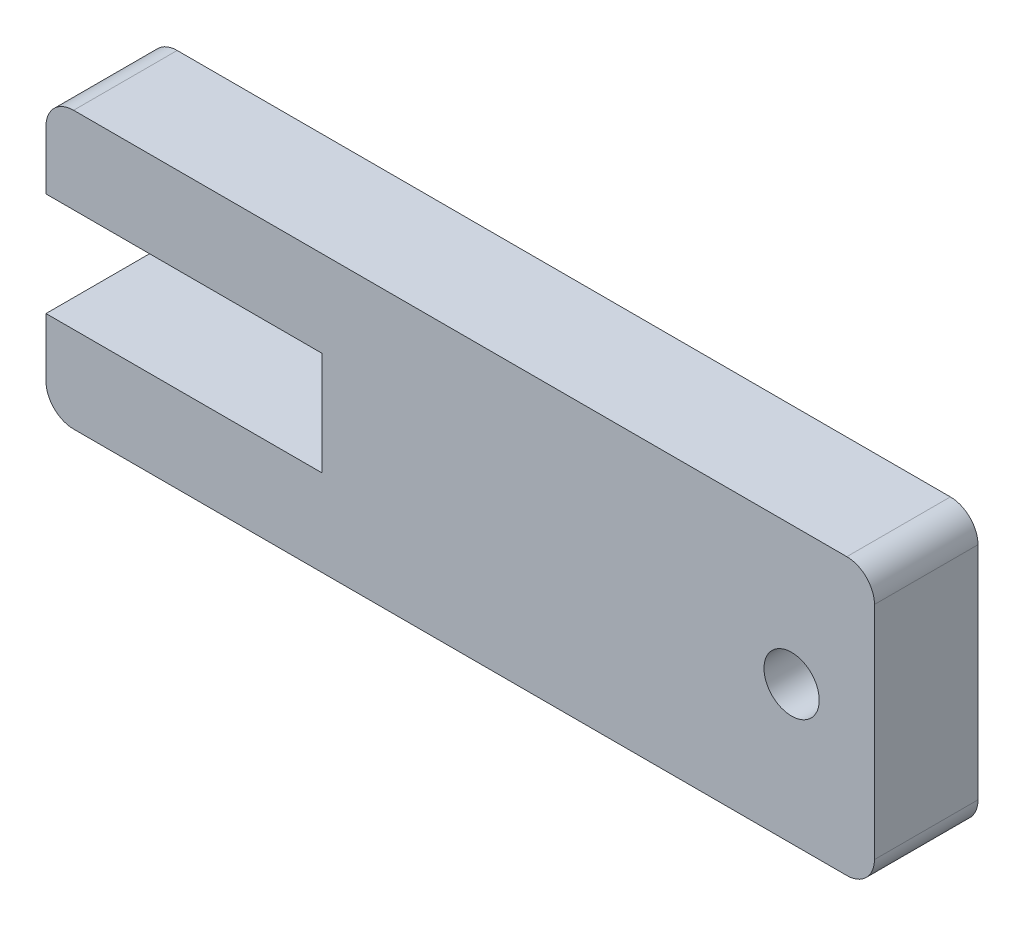
ISO-10303-21;
HEADER;
FILE_DESCRIPTION(('STEP AP214'),'2;1');
FILE_NAME('part.step','',(''),(''),'','','');
FILE_SCHEMA(('AUTOMOTIVE_DESIGN { 1 0 10303 214 1 1 1 1 }'));
ENDSEC;
DATA;
#1=APPLICATION_CONTEXT('core data for automotive mechanical design processes');
#2=APPLICATION_PROTOCOL_DEFINITION('international standard','automotive_design',2000,#1);
#3=PRODUCT_CONTEXT('',#1,'mechanical');
#4=PRODUCT('Part','Part','',(#3));
#5=PRODUCT_RELATED_PRODUCT_CATEGORY('part','',(#4));
#6=PRODUCT_DEFINITION_FORMATION('','',#4);
#7=PRODUCT_DEFINITION_CONTEXT('part definition',#1,'design');
#8=PRODUCT_DEFINITION('design','',#6,#7);
#9=PRODUCT_DEFINITION_SHAPE('','',#8);
#10=(LENGTH_UNIT() NAMED_UNIT(*) SI_UNIT(.MILLI.,.METRE.));
#11=(NAMED_UNIT(*) PLANE_ANGLE_UNIT() SI_UNIT($,.RADIAN.));
#12=(NAMED_UNIT(*) SI_UNIT($,.STERADIAN.) SOLID_ANGLE_UNIT());
#13=UNCERTAINTY_MEASURE_WITH_UNIT(LENGTH_MEASURE(1.E-05),#10,'distance_accuracy_value','');
#14=(GEOMETRIC_REPRESENTATION_CONTEXT(3) GLOBAL_UNCERTAINTY_ASSIGNED_CONTEXT((#13)) GLOBAL_UNIT_ASSIGNED_CONTEXT((#10,
#11,#12)) REPRESENTATION_CONTEXT('',''));
#15=CARTESIAN_POINT('',(0.,0.,0.));
#16=DIRECTION('',(0.,0.,1.));
#17=DIRECTION('',(1.,0.,0.));
#18=AXIS2_PLACEMENT_3D('',#15,#16,#17);
#19=CARTESIAN_POINT('',(0.,-2.38125,2.38125));
#20=DIRECTION('',(1.,0.,0.));
#21=DIRECTION('',(0.,0.,-1.));
#22=AXIS2_PLACEMENT_3D('',#19,#20,#21);
#23=PLANE('',#22);
#24=DIRECTION('',(0.,-1.,0.));
#25=VECTOR('',#24,1.);
#26=CARTESIAN_POINT('',(0.,-2.38125,-2.38125));
#27=LINE('',#26,#25);
#28=CARTESIAN_POINT('',(0.,2.38125,-2.38125));
#29=VERTEX_POINT('',#28);
#30=CARTESIAN_POINT('',(0.,-2.38125,-2.38125));
#31=VERTEX_POINT('',#30);
#32=EDGE_CURVE('E148',#29,#31,#27,.T.);
#33=ORIENTED_EDGE('',*,*,#32,.T.);
#34=DIRECTION('',(0.,0.,-1.));
#35=VECTOR('',#34,1.);
#36=CARTESIAN_POINT('',(0.,-2.38125,2.38125));
#37=LINE('',#36,#35);
#38=CARTESIAN_POINT('',(0.,-2.38125,2.38125));
#39=VERTEX_POINT('',#38);
#40=EDGE_CURVE('E129',#39,#31,#37,.T.);
#41=ORIENTED_EDGE('',*,*,#40,.F.);
#42=DIRECTION('',(0.,-1.,0.));
#43=VECTOR('',#42,1.);
#44=CARTESIAN_POINT('',(0.,-2.38125,2.38125));
#45=LINE('',#44,#43);
#46=CARTESIAN_POINT('',(0.,2.38125,2.38125));
#47=VERTEX_POINT('',#46);
#48=EDGE_CURVE('E136',#47,#39,#45,.T.);
#49=ORIENTED_EDGE('',*,*,#48,.F.);
#50=DIRECTION('',(0.,0.,-1.));
#51=VECTOR('',#50,1.);
#52=CARTESIAN_POINT('',(0.,2.38125,2.38125));
#53=LINE('',#52,#51);
#54=EDGE_CURVE('E204',#47,#29,#53,.T.);
#55=ORIENTED_EDGE('',*,*,#54,.T.);
#56=EDGE_LOOP('',(#33,#41,#49,#55));
#57=FACE_BOUND('',#56,.T.);
#58=ADVANCED_FACE('F34',(#57),#23,.F.);
#59=CARTESIAN_POINT('',(-12.7,-2.38125,2.38125));
#60=DIRECTION('',(0.,-1.,0.));
#61=DIRECTION('',(0.,0.,-1.));
#62=AXIS2_PLACEMENT_3D('',#59,#60,#61);
#63=PLANE('',#62);
#64=DIRECTION('',(-1.,0.,0.));
#65=VECTOR('',#64,1.);
#66=CARTESIAN_POINT('',(-12.7,-2.38125,-2.38125));
#67=LINE('',#66,#65);
#68=CARTESIAN_POINT('',(-12.7,-2.38125,-2.38125));
#69=VERTEX_POINT('',#68);
#70=EDGE_CURVE('E212',#31,#69,#67,.T.);
#71=ORIENTED_EDGE('',*,*,#70,.T.);
#72=DIRECTION('',(0.,0.,-1.));
#73=VECTOR('',#72,1.);
#74=CARTESIAN_POINT('',(-12.7,-2.38125,2.38125));
#75=LINE('',#74,#73);
#76=CARTESIAN_POINT('',(-12.7,-2.38125,2.38125));
#77=VERTEX_POINT('',#76);
#78=EDGE_CURVE('E132',#77,#69,#75,.T.);
#79=ORIENTED_EDGE('',*,*,#78,.F.);
#80=DIRECTION('',(-1.,0.,0.));
#81=VECTOR('',#80,1.);
#82=CARTESIAN_POINT('',(-12.7,-2.38125,2.38125));
#83=LINE('',#82,#81);
#84=EDGE_CURVE('E125',#39,#77,#83,.T.);
#85=ORIENTED_EDGE('',*,*,#84,.F.);
#86=ORIENTED_EDGE('',*,*,#40,.T.);
#87=EDGE_LOOP('',(#71,#79,#85,#86));
#88=FACE_BOUND('',#87,.T.);
#89=ADVANCED_FACE('F127',(#88),#63,.F.);
#90=CARTESIAN_POINT('',(-12.7,-2.38125,2.38125));
#91=DIRECTION('',(1.,0.,0.));
#92=DIRECTION('',(0.,0.,-1.));
#93=AXIS2_PLACEMENT_3D('',#90,#91,#92);
#94=PLANE('',#93);
#95=DIRECTION('',(0.,-1.,0.));
#96=VECTOR('',#95,1.);
#97=CARTESIAN_POINT('',(-12.7,-2.38125,-2.38125));
#98=LINE('',#97,#96);
#99=CARTESIAN_POINT('',(-12.7,-5.08,-2.38125));
#100=VERTEX_POINT('',#99);
#101=EDGE_CURVE('E215',#69,#100,#98,.T.);
#102=ORIENTED_EDGE('',*,*,#101,.T.);
#103=DIRECTION('',(0.,0.,-1.));
#104=VECTOR('',#103,1.);
#105=CARTESIAN_POINT('',(-12.7,-5.08,2.38125));
#106=LINE('',#105,#104);
#107=CARTESIAN_POINT('',(-12.7,-5.08,2.38125));
#108=VERTEX_POINT('',#107);
#109=EDGE_CURVE('E167',#100,#108,#106,.F.);
#110=ORIENTED_EDGE('',*,*,#109,.T.);
#111=DIRECTION('',(0.,-1.,0.));
#112=VECTOR('',#111,1.);
#113=CARTESIAN_POINT('',(-12.7,-2.38125,2.38125));
#114=LINE('',#113,#112);
#115=EDGE_CURVE('E135',#77,#108,#114,.T.);
#116=ORIENTED_EDGE('',*,*,#115,.F.);
#117=ORIENTED_EDGE('',*,*,#78,.T.);
#118=EDGE_LOOP('',(#102,#110,#116,#117));
#119=FACE_BOUND('',#118,.T.);
#120=ADVANCED_FACE('F264',(#119),#94,.F.);
#121=CARTESIAN_POINT('',(-12.7,-6.35,2.38125));
#122=DIRECTION('',(0.,1.,0.));
#123=DIRECTION('',(0.,0.,1.));
#124=AXIS2_PLACEMENT_3D('',#121,#122,#123);
#125=PLANE('',#124);
#126=DIRECTION('',(1.,0.,0.));
#127=VECTOR('',#126,1.);
#128=CARTESIAN_POINT('',(-12.7,-6.35,2.38125));
#129=LINE('',#128,#127);
#130=CARTESIAN_POINT('',(-11.43,-6.35,2.38125));
#131=VERTEX_POINT('',#130);
#132=CARTESIAN_POINT('',(24.13,-6.35,2.38125));
#133=VERTEX_POINT('',#132);
#134=EDGE_CURVE('E238',#131,#133,#129,.T.);
#135=ORIENTED_EDGE('',*,*,#134,.F.);
#136=DIRECTION('',(0.,0.,-1.));
#137=VECTOR('',#136,1.);
#138=CARTESIAN_POINT('',(-11.43,-6.35,2.38125));
#139=LINE('',#138,#137);
#140=CARTESIAN_POINT('',(-11.43,-6.35,-2.38125));
#141=VERTEX_POINT('',#140);
#142=EDGE_CURVE('E151',#131,#141,#139,.T.);
#143=ORIENTED_EDGE('',*,*,#142,.T.);
#144=DIRECTION('',(1.,0.,0.));
#145=VECTOR('',#144,1.);
#146=CARTESIAN_POINT('',(-12.7,-6.35,-2.38125));
#147=LINE('',#146,#145);
#148=CARTESIAN_POINT('',(24.13,-6.35,-2.38125));
#149=VERTEX_POINT('',#148);
#150=EDGE_CURVE('E199',#141,#149,#147,.T.);
#151=ORIENTED_EDGE('',*,*,#150,.T.);
#152=DIRECTION('',(0.,0.,-1.));
#153=VECTOR('',#152,1.);
#154=CARTESIAN_POINT('',(24.13,-6.35,2.38125));
#155=LINE('',#154,#153);
#156=EDGE_CURVE('E149',#149,#133,#155,.F.);
#157=ORIENTED_EDGE('',*,*,#156,.T.);
#158=EDGE_LOOP('',(#135,#143,#151,#157));
#159=FACE_BOUND('',#158,.T.);
#160=ADVANCED_FACE('F228',(#159),#125,.F.);
#161=CARTESIAN_POINT('',(25.4,6.35,2.38125));
#162=DIRECTION('',(-1.,0.,0.));
#163=DIRECTION('',(0.,0.,1.));
#164=AXIS2_PLACEMENT_3D('',#161,#162,#163);
#165=PLANE('',#164);
#166=DIRECTION('',(0.,1.,0.));
#167=VECTOR('',#166,1.);
#168=CARTESIAN_POINT('',(25.4,6.35,2.38125));
#169=LINE('',#168,#167);
#170=CARTESIAN_POINT('',(25.4,-5.08,2.38125));
#171=VERTEX_POINT('',#170);
#172=CARTESIAN_POINT('',(25.4,5.08,2.38125));
#173=VERTEX_POINT('',#172);
#174=EDGE_CURVE('E237',#171,#173,#169,.T.);
#175=ORIENTED_EDGE('',*,*,#174,.F.);
#176=DIRECTION('',(0.,0.,-1.));
#177=VECTOR('',#176,1.);
#178=CARTESIAN_POINT('',(25.4,-5.08,2.38125));
#179=LINE('',#178,#177);
#180=CARTESIAN_POINT('',(25.4,-5.08,-2.38125));
#181=VERTEX_POINT('',#180);
#182=EDGE_CURVE('E178',#171,#181,#179,.T.);
#183=ORIENTED_EDGE('',*,*,#182,.T.);
#184=DIRECTION('',(0.,1.,0.));
#185=VECTOR('',#184,1.);
#186=CARTESIAN_POINT('',(25.4,6.35,-2.38125));
#187=LINE('',#186,#185);
#188=CARTESIAN_POINT('',(25.4,5.08,-2.38125));
#189=VERTEX_POINT('',#188);
#190=EDGE_CURVE('E196',#181,#189,#187,.T.);
#191=ORIENTED_EDGE('',*,*,#190,.T.);
#192=DIRECTION('',(0.,0.,-1.));
#193=VECTOR('',#192,1.);
#194=CARTESIAN_POINT('',(25.4,5.08,2.38125));
#195=LINE('',#194,#193);
#196=EDGE_CURVE('E176',#189,#173,#195,.F.);
#197=ORIENTED_EDGE('',*,*,#196,.T.);
#198=EDGE_LOOP('',(#175,#183,#191,#197));
#199=FACE_BOUND('',#198,.T.);
#200=ADVANCED_FACE('F240',(#199),#165,.F.);
#201=CARTESIAN_POINT('',(-12.7,6.35,2.38125));
#202=DIRECTION('',(0.,-1.,0.));
#203=DIRECTION('',(0.,0.,-1.));
#204=AXIS2_PLACEMENT_3D('',#201,#202,#203);
#205=PLANE('',#204);
#206=DIRECTION('',(-1.,0.,0.));
#207=VECTOR('',#206,1.);
#208=CARTESIAN_POINT('',(-12.7,6.35,2.38125));
#209=LINE('',#208,#207);
#210=CARTESIAN_POINT('',(24.13,6.35,2.38125));
#211=VERTEX_POINT('',#210);
#212=CARTESIAN_POINT('',(-11.43,6.35,2.38125));
#213=VERTEX_POINT('',#212);
#214=EDGE_CURVE('E186',#211,#213,#209,.T.);
#215=ORIENTED_EDGE('',*,*,#214,.F.);
#216=DIRECTION('',(0.,0.,-1.));
#217=VECTOR('',#216,1.);
#218=CARTESIAN_POINT('',(24.13,6.35,2.38125));
#219=LINE('',#218,#217);
#220=CARTESIAN_POINT('',(24.13,6.35,-2.38125));
#221=VERTEX_POINT('',#220);
#222=EDGE_CURVE('E42',#211,#221,#219,.T.);
#223=ORIENTED_EDGE('',*,*,#222,.T.);
#224=DIRECTION('',(-1.,0.,0.));
#225=VECTOR('',#224,1.);
#226=CARTESIAN_POINT('',(-12.7,6.35,-2.38125));
#227=LINE('',#226,#225);
#228=CARTESIAN_POINT('',(-11.43,6.35,-2.38125));
#229=VERTEX_POINT('',#228);
#230=EDGE_CURVE('E185',#221,#229,#227,.T.);
#231=ORIENTED_EDGE('',*,*,#230,.T.);
#232=DIRECTION('',(0.,0.,-1.));
#233=VECTOR('',#232,1.);
#234=CARTESIAN_POINT('',(-11.43,6.35,2.38125));
#235=LINE('',#234,#233);
#236=EDGE_CURVE('E57',#229,#213,#235,.F.);
#237=ORIENTED_EDGE('',*,*,#236,.T.);
#238=EDGE_LOOP('',(#215,#223,#231,#237));
#239=FACE_BOUND('',#238,.T.);
#240=ADVANCED_FACE('F184',(#239),#205,.F.);
#241=CARTESIAN_POINT('',(-12.7,2.38125,2.38125));
#242=DIRECTION('',(1.,0.,0.));
#243=DIRECTION('',(0.,0.,-1.));
#244=AXIS2_PLACEMENT_3D('',#241,#242,#243);
#245=PLANE('',#244);
#246=DIRECTION('',(0.,-1.,0.));
#247=VECTOR('',#246,1.);
#248=CARTESIAN_POINT('',(-12.7,2.38125,2.38125));
#249=LINE('',#248,#247);
#250=CARTESIAN_POINT('',(-12.7,5.08,2.38125));
#251=VERTEX_POINT('',#250);
#252=CARTESIAN_POINT('',(-12.7,2.38125,2.38125));
#253=VERTEX_POINT('',#252);
#254=EDGE_CURVE('E243',#251,#253,#249,.T.);
#255=ORIENTED_EDGE('',*,*,#254,.F.);
#256=DIRECTION('',(0.,0.,-1.));
#257=VECTOR('',#256,1.);
#258=CARTESIAN_POINT('',(-12.7,5.08,2.38125));
#259=LINE('',#258,#257);
#260=CARTESIAN_POINT('',(-12.7,5.08,-2.38125));
#261=VERTEX_POINT('',#260);
#262=EDGE_CURVE('E11',#251,#261,#259,.T.);
#263=ORIENTED_EDGE('',*,*,#262,.T.);
#264=DIRECTION('',(0.,-1.,0.));
#265=VECTOR('',#264,1.);
#266=CARTESIAN_POINT('',(-12.7,2.38125,-2.38125));
#267=LINE('',#266,#265);
#268=CARTESIAN_POINT('',(-12.7,2.38125,-2.38125));
#269=VERTEX_POINT('',#268);
#270=EDGE_CURVE('E195',#261,#269,#267,.T.);
#271=ORIENTED_EDGE('',*,*,#270,.T.);
#272=DIRECTION('',(0.,0.,-1.));
#273=VECTOR('',#272,1.);
#274=CARTESIAN_POINT('',(-12.7,2.38125,2.38125));
#275=LINE('',#274,#273);
#276=EDGE_CURVE('E153',#253,#269,#275,.T.);
#277=ORIENTED_EDGE('',*,*,#276,.F.);
#278=EDGE_LOOP('',(#255,#263,#271,#277));
#279=FACE_BOUND('',#278,.T.);
#280=ADVANCED_FACE('F248',(#279),#245,.F.);
#281=CARTESIAN_POINT('',(-12.7,2.38125,2.38125));
#282=DIRECTION('',(0.,1.,0.));
#283=DIRECTION('',(0.,0.,1.));
#284=AXIS2_PLACEMENT_3D('',#281,#282,#283);
#285=PLANE('',#284);
#286=DIRECTION('',(1.,0.,0.));
#287=VECTOR('',#286,1.);
#288=CARTESIAN_POINT('',(-12.7,2.38125,-2.38125));
#289=LINE('',#288,#287);
#290=EDGE_CURVE('E145',#269,#29,#289,.T.);
#291=ORIENTED_EDGE('',*,*,#290,.T.);
#292=ORIENTED_EDGE('',*,*,#54,.F.);
#293=DIRECTION('',(1.,0.,0.));
#294=VECTOR('',#293,1.);
#295=CARTESIAN_POINT('',(-12.7,2.38125,2.38125));
#296=LINE('',#295,#294);
#297=EDGE_CURVE('E141',#253,#47,#296,.T.);
#298=ORIENTED_EDGE('',*,*,#297,.F.);
#299=ORIENTED_EDGE('',*,*,#276,.T.);
#300=EDGE_LOOP('',(#291,#292,#298,#299));
#301=FACE_BOUND('',#300,.T.);
#302=ADVANCED_FACE('F209',(#301),#285,.F.);
#303=CARTESIAN_POINT('',(0.,0.,2.38125));
#304=DIRECTION('',(0.,0.,-1.));
#305=DIRECTION('',(-1.,0.,0.));
#306=AXIS2_PLACEMENT_3D('',#303,#304,#305);
#307=PLANE('',#306);
#308=CARTESIAN_POINT('',(21.59,0.,2.38125));
#309=DIRECTION('',(0.,0.,1.));
#310=DIRECTION('',(1.,0.,0.));
#311=AXIS2_PLACEMENT_3D('',#308,#309,#310);
#312=CIRCLE('',#311,1.27);
#313=CARTESIAN_POINT('',(22.86,0.,2.38125));
#314=VERTEX_POINT('',#313);
#315=EDGE_CURVE('E218',#314,#314,#312,.T.);
#316=ORIENTED_EDGE('',*,*,#315,.F.);
#317=EDGE_LOOP('',(#316));
#318=FACE_BOUND('',#317,.T.);
#319=ORIENTED_EDGE('',*,*,#115,.T.);
#320=CARTESIAN_POINT('',(-11.43,-5.08,2.38125));
#321=DIRECTION('',(0.,0.,-1.));
#322=DIRECTION('',(-1.,0.,0.));
#323=AXIS2_PLACEMENT_3D('',#320,#321,#322);
#324=CIRCLE('',#323,1.27);
#325=EDGE_CURVE('E174',#108,#131,#324,.F.);
#326=ORIENTED_EDGE('',*,*,#325,.T.);
#327=ORIENTED_EDGE('',*,*,#134,.T.);
#328=CARTESIAN_POINT('',(24.13,-5.08,2.38125));
#329=DIRECTION('',(0.,0.,-1.));
#330=DIRECTION('',(-1.,0.,0.));
#331=AXIS2_PLACEMENT_3D('',#328,#329,#330);
#332=CIRCLE('',#331,1.27);
#333=EDGE_CURVE('E172',#133,#171,#332,.F.);
#334=ORIENTED_EDGE('',*,*,#333,.T.);
#335=ORIENTED_EDGE('',*,*,#174,.T.);
#336=CARTESIAN_POINT('',(24.13,5.08,2.38125));
#337=DIRECTION('',(0.,0.,-1.));
#338=DIRECTION('',(-1.,0.,0.));
#339=AXIS2_PLACEMENT_3D('',#336,#337,#338);
#340=CIRCLE('',#339,1.27);
#341=EDGE_CURVE('E170',#173,#211,#340,.F.);
#342=ORIENTED_EDGE('',*,*,#341,.T.);
#343=ORIENTED_EDGE('',*,*,#214,.T.);
#344=CARTESIAN_POINT('',(-11.43,5.08,2.38125));
#345=DIRECTION('',(0.,0.,-1.));
#346=DIRECTION('',(-1.,0.,0.));
#347=AXIS2_PLACEMENT_3D('',#344,#345,#346);
#348=CIRCLE('',#347,1.27);
#349=EDGE_CURVE('E49',#213,#251,#348,.F.);
#350=ORIENTED_EDGE('',*,*,#349,.T.);
#351=ORIENTED_EDGE('',*,*,#254,.T.);
#352=ORIENTED_EDGE('',*,*,#297,.T.);
#353=ORIENTED_EDGE('',*,*,#48,.T.);
#354=ORIENTED_EDGE('',*,*,#84,.T.);
#355=EDGE_LOOP('',(#319,#326,#327,#334,#335,#342,#343,#350,#351,#352,#353,#354));
#356=FACE_BOUND('',#355,.T.);
#357=ADVANCED_FACE('F139',(#318,#356),#307,.F.);
#358=CARTESIAN_POINT('',(0.,0.,-2.38125));
#359=DIRECTION('',(0.,0.,-1.));
#360=DIRECTION('',(-1.,0.,0.));
#361=AXIS2_PLACEMENT_3D('',#358,#359,#360);
#362=PLANE('',#361);
#363=CARTESIAN_POINT('',(21.59,0.,-2.38125));
#364=DIRECTION('',(0.,0.,1.));
#365=DIRECTION('',(1.,0.,0.));
#366=AXIS2_PLACEMENT_3D('',#363,#364,#365);
#367=CIRCLE('',#366,1.27);
#368=CARTESIAN_POINT('',(22.86,0.,-2.38125));
#369=VERTEX_POINT('',#368);
#370=EDGE_CURVE('E213',#369,#369,#367,.T.);
#371=ORIENTED_EDGE('',*,*,#370,.T.);
#372=EDGE_LOOP('',(#371));
#373=FACE_BOUND('',#372,.T.);
#374=ORIENTED_EDGE('',*,*,#150,.F.);
#375=CARTESIAN_POINT('',(-11.43,-5.08,-2.38125));
#376=DIRECTION('',(0.,0.,-1.));
#377=DIRECTION('',(-1.,0.,0.));
#378=AXIS2_PLACEMENT_3D('',#375,#376,#377);
#379=CIRCLE('',#378,1.27);
#380=EDGE_CURVE('E165',#141,#100,#379,.T.);
#381=ORIENTED_EDGE('',*,*,#380,.T.);
#382=ORIENTED_EDGE('',*,*,#101,.F.);
#383=ORIENTED_EDGE('',*,*,#70,.F.);
#384=ORIENTED_EDGE('',*,*,#32,.F.);
#385=ORIENTED_EDGE('',*,*,#290,.F.);
#386=ORIENTED_EDGE('',*,*,#270,.F.);
#387=CARTESIAN_POINT('',(-11.43,5.08,-2.38125));
#388=DIRECTION('',(0.,0.,-1.));
#389=DIRECTION('',(-1.,0.,0.));
#390=AXIS2_PLACEMENT_3D('',#387,#388,#389);
#391=CIRCLE('',#390,1.27);
#392=EDGE_CURVE('E159',#261,#229,#391,.T.);
#393=ORIENTED_EDGE('',*,*,#392,.T.);
#394=ORIENTED_EDGE('',*,*,#230,.F.);
#395=CARTESIAN_POINT('',(24.13,5.08,-2.38125));
#396=DIRECTION('',(0.,0.,-1.));
#397=DIRECTION('',(-1.,0.,0.));
#398=AXIS2_PLACEMENT_3D('',#395,#396,#397);
#399=CIRCLE('',#398,1.27);
#400=EDGE_CURVE('E161',#221,#189,#399,.T.);
#401=ORIENTED_EDGE('',*,*,#400,.T.);
#402=ORIENTED_EDGE('',*,*,#190,.F.);
#403=CARTESIAN_POINT('',(24.13,-5.08,-2.38125));
#404=DIRECTION('',(0.,0.,-1.));
#405=DIRECTION('',(-1.,0.,0.));
#406=AXIS2_PLACEMENT_3D('',#403,#404,#405);
#407=CIRCLE('',#406,1.27);
#408=EDGE_CURVE('E163',#181,#149,#407,.T.);
#409=ORIENTED_EDGE('',*,*,#408,.T.);
#410=EDGE_LOOP('',(#374,#381,#382,#383,#384,#385,#386,#393,#394,#401,#402,#409));
#411=FACE_BOUND('',#410,.T.);
#412=ADVANCED_FACE('F191',(#373,#411),#362,.T.);
#413=CARTESIAN_POINT('',(-11.43,-5.08,2.38125));
#414=DIRECTION('',(0.,0.,-1.));
#415=DIRECTION('',(-1.,0.,0.));
#416=AXIS2_PLACEMENT_3D('',#413,#414,#415);
#417=CYLINDRICAL_SURFACE('',#416,1.27);
#418=ORIENTED_EDGE('',*,*,#325,.F.);
#419=ORIENTED_EDGE('',*,*,#109,.F.);
#420=ORIENTED_EDGE('',*,*,#380,.F.);
#421=ORIENTED_EDGE('',*,*,#142,.F.);
#422=EDGE_LOOP('',(#418,#419,#420,#421));
#423=FACE_BOUND('',#422,.T.);
#424=ADVANCED_FACE('F268',(#423),#417,.T.);
#425=CARTESIAN_POINT('',(24.13,-5.08,2.38125));
#426=DIRECTION('',(0.,0.,-1.));
#427=DIRECTION('',(-1.,0.,0.));
#428=AXIS2_PLACEMENT_3D('',#425,#426,#427);
#429=CYLINDRICAL_SURFACE('',#428,1.27);
#430=ORIENTED_EDGE('',*,*,#333,.F.);
#431=ORIENTED_EDGE('',*,*,#156,.F.);
#432=ORIENTED_EDGE('',*,*,#408,.F.);
#433=ORIENTED_EDGE('',*,*,#182,.F.);
#434=EDGE_LOOP('',(#430,#431,#432,#433));
#435=FACE_BOUND('',#434,.T.);
#436=ADVANCED_FACE('F233',(#435),#429,.T.);
#437=CARTESIAN_POINT('',(24.13,5.08,2.38125));
#438=DIRECTION('',(0.,0.,-1.));
#439=DIRECTION('',(-1.,0.,0.));
#440=AXIS2_PLACEMENT_3D('',#437,#438,#439);
#441=CYLINDRICAL_SURFACE('',#440,1.27);
#442=ORIENTED_EDGE('',*,*,#341,.F.);
#443=ORIENTED_EDGE('',*,*,#196,.F.);
#444=ORIENTED_EDGE('',*,*,#400,.F.);
#445=ORIENTED_EDGE('',*,*,#222,.F.);
#446=EDGE_LOOP('',(#442,#443,#444,#445));
#447=FACE_BOUND('',#446,.T.);
#448=ADVANCED_FACE('F252',(#447),#441,.T.);
#449=CARTESIAN_POINT('',(-11.43,5.08,2.38125));
#450=DIRECTION('',(0.,0.,-1.));
#451=DIRECTION('',(-1.,0.,0.));
#452=AXIS2_PLACEMENT_3D('',#449,#450,#451);
#453=CYLINDRICAL_SURFACE('',#452,1.27);
#454=ORIENTED_EDGE('',*,*,#349,.F.);
#455=ORIENTED_EDGE('',*,*,#236,.F.);
#456=ORIENTED_EDGE('',*,*,#392,.F.);
#457=ORIENTED_EDGE('',*,*,#262,.F.);
#458=EDGE_LOOP('',(#454,#455,#456,#457));
#459=FACE_BOUND('',#458,.T.);
#460=ADVANCED_FACE('F36',(#459),#453,.T.);
#461=CARTESIAN_POINT('',(21.59,0.,-2.38125));
#462=DIRECTION('',(0.,0.,1.));
#463=DIRECTION('',(1.,0.,0.));
#464=AXIS2_PLACEMENT_3D('',#461,#462,#463);
#465=CYLINDRICAL_SURFACE('',#464,1.27);
#466=CARTESIAN_POINT('',(22.86,0.,-2.38125));
#467=CARTESIAN_POINT('',(22.86,0.,-2.331640625));
#468=CARTESIAN_POINT('',(22.86,0.,-2.28203125));
#469=CARTESIAN_POINT('',(22.86,0.,-2.1828125));
#470=CARTESIAN_POINT('',(22.86,0.,-2.133203125));
#471=CARTESIAN_POINT('',(22.86,0.,-2.033984375));
#472=CARTESIAN_POINT('',(22.86,0.,-1.984375));
#473=CARTESIAN_POINT('',(22.86,0.,-1.88515625));
#474=CARTESIAN_POINT('',(22.86,0.,-1.835546875));
#475=CARTESIAN_POINT('',(22.86,0.,-1.736328125));
#476=CARTESIAN_POINT('',(22.86,0.,-1.68671875));
#477=CARTESIAN_POINT('',(22.86,0.,-1.5875));
#478=CARTESIAN_POINT('',(22.86,0.,-1.537890625));
#479=CARTESIAN_POINT('',(22.86,0.,-1.438671875));
#480=CARTESIAN_POINT('',(22.86,0.,-1.3890625));
#481=CARTESIAN_POINT('',(22.86,0.,-1.28984375));
#482=CARTESIAN_POINT('',(22.86,0.,-1.240234375));
#483=CARTESIAN_POINT('',(22.86,0.,-1.141015625));
#484=CARTESIAN_POINT('',(22.86,0.,-1.09140625));
#485=CARTESIAN_POINT('',(22.86,0.,-0.9921875));
#486=CARTESIAN_POINT('',(22.86,0.,-0.942578125));
#487=CARTESIAN_POINT('',(22.86,0.,-0.843359375));
#488=CARTESIAN_POINT('',(22.86,0.,-0.79375));
#489=CARTESIAN_POINT('',(22.86,0.,-0.69453125));
#490=CARTESIAN_POINT('',(22.86,0.,-0.644921875));
#491=CARTESIAN_POINT('',(22.86,0.,-0.545703125));
#492=CARTESIAN_POINT('',(22.86,0.,-0.49609375));
#493=CARTESIAN_POINT('',(22.86,0.,-0.396875));
#494=CARTESIAN_POINT('',(22.86,0.,-0.347265625));
#495=CARTESIAN_POINT('',(22.86,0.,-0.248046875000001));
#496=CARTESIAN_POINT('',(22.86,0.,-0.198437500000001));
#497=CARTESIAN_POINT('',(22.86,0.,-0.0992187500000005));
#498=CARTESIAN_POINT('',(22.86,0.,-0.0496093750000005));
#499=CARTESIAN_POINT('',(22.86,0.,0.0496093749999996));
#500=CARTESIAN_POINT('',(22.86,0.,0.0992187499999996));
#501=CARTESIAN_POINT('',(22.86,0.,0.1984375));
#502=CARTESIAN_POINT('',(22.86,0.,0.248046875));
#503=CARTESIAN_POINT('',(22.86,0.,0.347265625));
#504=CARTESIAN_POINT('',(22.86,0.,0.396875));
#505=CARTESIAN_POINT('',(22.86,0.,0.49609375));
#506=CARTESIAN_POINT('',(22.86,0.,0.545703125));
#507=CARTESIAN_POINT('',(22.86,0.,0.644921875));
#508=CARTESIAN_POINT('',(22.86,0.,0.69453125));
#509=CARTESIAN_POINT('',(22.86,0.,0.79375));
#510=CARTESIAN_POINT('',(22.86,0.,0.843359375));
#511=CARTESIAN_POINT('',(22.86,0.,0.942578125));
#512=CARTESIAN_POINT('',(22.86,0.,0.9921875));
#513=CARTESIAN_POINT('',(22.86,0.,1.09140625));
#514=CARTESIAN_POINT('',(22.86,0.,1.141015625));
#515=CARTESIAN_POINT('',(22.86,0.,1.240234375));
#516=CARTESIAN_POINT('',(22.86,0.,1.28984375));
#517=CARTESIAN_POINT('',(22.86,0.,1.3890625));
#518=CARTESIAN_POINT('',(22.86,0.,1.438671875));
#519=CARTESIAN_POINT('',(22.86,0.,1.537890625));
#520=CARTESIAN_POINT('',(22.86,0.,1.5875));
#521=CARTESIAN_POINT('',(22.86,0.,1.68671875));
#522=CARTESIAN_POINT('',(22.86,0.,1.736328125));
#523=CARTESIAN_POINT('',(22.86,0.,1.835546875));
#524=CARTESIAN_POINT('',(22.86,0.,1.88515625));
#525=CARTESIAN_POINT('',(22.86,0.,1.984375));
#526=CARTESIAN_POINT('',(22.86,0.,2.033984375));
#527=CARTESIAN_POINT('',(22.86,0.,2.133203125));
#528=CARTESIAN_POINT('',(22.86,0.,2.1828125));
#529=CARTESIAN_POINT('',(22.86,0.,2.28203125));
#530=CARTESIAN_POINT('',(22.86,0.,2.331640625));
#531=CARTESIAN_POINT('',(22.86,0.,2.38125));
#532=B_SPLINE_CURVE_WITH_KNOTS('',3,(#466,#467,#468,#469,#470,#471,#472,#473,#474,#475,#476,
#477,#478,#479,#480,#481,#482,#483,#484,#485,#486,#487,#488,#489,#490,#491,#492,#493,#494,#495,
#496,#497,#498,#499,#500,#501,#502,#503,#504,#505,#506,#507,#508,#509,#510,#511,#512,#513,#514,
#515,#516,#517,#518,#519,#520,#521,#522,#523,#524,#525,#526,#527,#528,#529,#530,#531),
.UNSPECIFIED.,.F.,.F.,(4,2,2,2,2,2,2,2,2,2,2,2,2,2,2,2,2,2,2,2,2,2,2,2,2,2,2,2,2,2,2,2,4),(0.,
0.148828125,0.29765625,0.446484375,0.5953125,0.744140625,0.89296875,1.041796875,1.190625,
1.339453125,1.48828125,1.637109375,1.7859375,1.934765625,2.08359375,2.232421875,2.38125,
2.530078125,2.67890625,2.827734375,2.9765625,3.125390625,3.27421875,3.423046875,3.571875,
3.720703125,3.86953125,4.018359375,4.1671875,4.316015625,4.46484375,4.613671875,4.7625),.UNSPECIFIED.);
#533=EDGE_CURVE('BSEAM251',#369,#314,#532,.T.);
#534=ORIENTED_EDGE('',*,*,#370,.F.);
#535=ORIENTED_EDGE('',*,*,#315,.T.);
#536=ORIENTED_EDGE('',*,*,#533,.T.);
#537=ORIENTED_EDGE('',*,*,#533,.F.);
#538=EDGE_LOOP('',(#534,#536,#535,#537));
#539=FACE_BOUND('',#538,.T.);
#540=ADVANCED_FACE('F251',(#539),#465,.F.);
#541=CLOSED_SHELL('',(#58,#89,#120,#160,#200,#240,#280,#302,#357,#412,#424,#436,#448,#460,#540));
#542=MANIFOLD_SOLID_BREP('B2',#541);
#543=ADVANCED_BREP_SHAPE_REPRESENTATION('',(#18,#542),#14);
#544=SHAPE_DEFINITION_REPRESENTATION(#9,#543);
ENDSEC;
END-ISO-10303-21;
